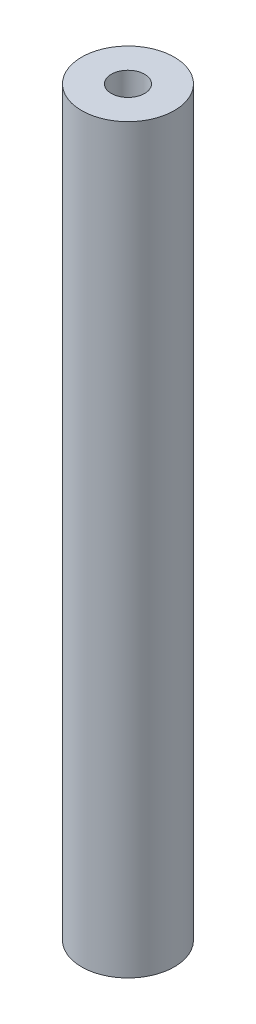
ISO-10303-21;
HEADER;
FILE_DESCRIPTION(('STEP AP214'),'2;1');
FILE_NAME('part.step','',(''),(''),'','','');
FILE_SCHEMA(('AUTOMOTIVE_DESIGN { 1 0 10303 214 1 1 1 1 }'));
ENDSEC;
DATA;
#1=APPLICATION_CONTEXT('core data for automotive mechanical design processes');
#2=APPLICATION_PROTOCOL_DEFINITION('international standard','automotive_design',2000,#1);
#3=PRODUCT_CONTEXT('',#1,'mechanical');
#4=PRODUCT('Part','Part','',(#3));
#5=PRODUCT_RELATED_PRODUCT_CATEGORY('part','',(#4));
#6=PRODUCT_DEFINITION_FORMATION('','',#4);
#7=PRODUCT_DEFINITION_CONTEXT('part definition',#1,'design');
#8=PRODUCT_DEFINITION('design','',#6,#7);
#9=PRODUCT_DEFINITION_SHAPE('','',#8);
#10=(LENGTH_UNIT() NAMED_UNIT(*) SI_UNIT(.MILLI.,.METRE.));
#11=(NAMED_UNIT(*) PLANE_ANGLE_UNIT() SI_UNIT($,.RADIAN.));
#12=(NAMED_UNIT(*) SI_UNIT($,.STERADIAN.) SOLID_ANGLE_UNIT());
#13=UNCERTAINTY_MEASURE_WITH_UNIT(LENGTH_MEASURE(1.E-05),#10,'distance_accuracy_value','');
#14=(GEOMETRIC_REPRESENTATION_CONTEXT(3) GLOBAL_UNCERTAINTY_ASSIGNED_CONTEXT((#13)) GLOBAL_UNIT_ASSIGNED_CONTEXT((#10,
#11,#12)) REPRESENTATION_CONTEXT('',''));
#15=CARTESIAN_POINT('',(0.,0.,0.));
#16=DIRECTION('',(0.,0.,1.));
#17=DIRECTION('',(1.,0.,0.));
#18=AXIS2_PLACEMENT_3D('',#15,#16,#17);
#19=CARTESIAN_POINT('',(0.,88.9,0.));
#20=DIRECTION('',(0.,-1.,0.));
#21=DIRECTION('',(0.,0.,-1.));
#22=AXIS2_PLACEMENT_3D('',#19,#20,#21);
#23=CYLINDRICAL_SURFACE('',#22,5.55625);
#24=CARTESIAN_POINT('',(0.,88.9,0.));
#25=DIRECTION('',(0.,1.,0.));
#26=DIRECTION('',(0.,0.,1.));
#27=AXIS2_PLACEMENT_3D('',#24,#25,#26);
#28=CIRCLE('',#27,5.55625);
#29=CARTESIAN_POINT('',(0.,88.9,5.55625));
#30=VERTEX_POINT('',#29);
#31=EDGE_CURVE('E10',#30,#30,#28,.T.);
#32=ORIENTED_EDGE('',*,*,#31,.F.);
#33=EDGE_LOOP('',(#32));
#34=FACE_BOUND('',#33,.T.);
#35=CARTESIAN_POINT('',(0.,0.,0.));
#36=DIRECTION('',(0.,1.,0.));
#37=DIRECTION('',(0.,0.,1.));
#38=AXIS2_PLACEMENT_3D('',#35,#36,#37);
#39=CIRCLE('',#38,5.55625);
#40=CARTESIAN_POINT('',(0.,0.,5.55625));
#41=VERTEX_POINT('',#40);
#42=EDGE_CURVE('E40',#41,#41,#39,.T.);
#43=ORIENTED_EDGE('',*,*,#42,.T.);
#44=EDGE_LOOP('',(#43));
#45=FACE_BOUND('',#44,.T.);
#46=ADVANCED_FACE('F37',(#34,#45),#23,.T.);
#47=CARTESIAN_POINT('',(0.,88.9,0.));
#48=DIRECTION('',(0.,1.,0.));
#49=DIRECTION('',(0.,0.,1.));
#50=AXIS2_PLACEMENT_3D('',#47,#48,#49);
#51=PLANE('',#50);
#52=CARTESIAN_POINT('',(0.,88.9,0.));
#53=DIRECTION('',(0.,1.,0.));
#54=DIRECTION('',(0.,0.,1.));
#55=AXIS2_PLACEMENT_3D('',#52,#53,#54);
#56=CIRCLE('',#55,1.999996);
#57=CARTESIAN_POINT('',(0.,88.9,1.999996));
#58=VERTEX_POINT('',#57);
#59=EDGE_CURVE('E49',#58,#58,#56,.T.);
#60=ORIENTED_EDGE('',*,*,#59,.F.);
#61=EDGE_LOOP('',(#60));
#62=FACE_BOUND('',#61,.T.);
#63=ORIENTED_EDGE('',*,*,#31,.T.);
#64=EDGE_LOOP('',(#63));
#65=FACE_BOUND('',#64,.T.);
#66=ADVANCED_FACE('F74',(#62,#65),#51,.T.);
#67=CARTESIAN_POINT('',(0.,0.,0.));
#68=DIRECTION('',(0.,1.,0.));
#69=DIRECTION('',(0.,0.,1.));
#70=AXIS2_PLACEMENT_3D('',#67,#68,#69);
#71=PLANE('',#70);
#72=CARTESIAN_POINT('',(0.,0.,0.));
#73=DIRECTION('',(0.,-1.,0.));
#74=DIRECTION('',(0.,0.,-1.));
#75=AXIS2_PLACEMENT_3D('',#72,#73,#74);
#76=CIRCLE('',#75,2.);
#77=CARTESIAN_POINT('',(0.,0.,-2.));
#78=VERTEX_POINT('',#77);
#79=EDGE_CURVE('E55',#78,#78,#76,.T.);
#80=ORIENTED_EDGE('',*,*,#79,.F.);
#81=EDGE_LOOP('',(#80));
#82=FACE_BOUND('',#81,.T.);
#83=ORIENTED_EDGE('',*,*,#42,.F.);
#84=EDGE_LOOP('',(#83));
#85=FACE_BOUND('',#84,.T.);
#86=ADVANCED_FACE('F70',(#82,#85),#71,.F.);
#87=CARTESIAN_POINT('',(0.,81.9,0.));
#88=DIRECTION('',(0.,1.,0.));
#89=DIRECTION('',(0.,0.,1.));
#90=AXIS2_PLACEMENT_3D('',#87,#88,#89);
#91=CYLINDRICAL_SURFACE('',#90,1.999996);
#92=CARTESIAN_POINT('',(0.,81.9,0.));
#93=DIRECTION('',(0.,1.,0.));
#94=DIRECTION('',(0.,0.,1.));
#95=AXIS2_PLACEMENT_3D('',#92,#93,#94);
#96=CIRCLE('',#95,1.999996);
#97=CARTESIAN_POINT('',(0.,81.9,1.999996));
#98=VERTEX_POINT('',#97);
#99=EDGE_CURVE('E47',#98,#98,#96,.T.);
#100=ORIENTED_EDGE('',*,*,#99,.F.);
#101=EDGE_LOOP('',(#100));
#102=FACE_BOUND('',#101,.T.);
#103=ORIENTED_EDGE('',*,*,#59,.T.);
#104=EDGE_LOOP('',(#103));
#105=FACE_BOUND('',#104,.T.);
#106=ADVANCED_FACE('F73',(#102,#105),#91,.F.);
#107=CARTESIAN_POINT('',(0.,81.9,0.));
#108=DIRECTION('',(0.,1.,0.));
#109=DIRECTION('',(0.,0.,1.));
#110=AXIS2_PLACEMENT_3D('',#107,#108,#109);
#111=PLANE('',#110);
#112=ORIENTED_EDGE('',*,*,#99,.T.);
#113=EDGE_LOOP('',(#112));
#114=FACE_BOUND('',#113,.T.);
#115=ADVANCED_FACE('F66',(#114),#111,.T.);
#116=CARTESIAN_POINT('',(0.,7.,0.));
#117=DIRECTION('',(0.,-1.,0.));
#118=DIRECTION('',(0.,0.,-1.));
#119=AXIS2_PLACEMENT_3D('',#116,#117,#118);
#120=CYLINDRICAL_SURFACE('',#119,2.);
#121=CARTESIAN_POINT('',(0.,7.,0.));
#122=DIRECTION('',(0.,-1.,0.));
#123=DIRECTION('',(0.,0.,-1.));
#124=AXIS2_PLACEMENT_3D('',#121,#122,#123);
#125=CIRCLE('',#124,2.);
#126=CARTESIAN_POINT('',(0.,7.,-2.));
#127=VERTEX_POINT('',#126);
#128=EDGE_CURVE('E52',#127,#127,#125,.T.);
#129=ORIENTED_EDGE('',*,*,#128,.F.);
#130=EDGE_LOOP('',(#129));
#131=FACE_BOUND('',#130,.T.);
#132=ORIENTED_EDGE('',*,*,#79,.T.);
#133=EDGE_LOOP('',(#132));
#134=FACE_BOUND('',#133,.T.);
#135=ADVANCED_FACE('F63',(#131,#134),#120,.F.);
#136=CARTESIAN_POINT('',(0.,7.,0.));
#137=DIRECTION('',(0.,-1.,0.));
#138=DIRECTION('',(0.,0.,-1.));
#139=AXIS2_PLACEMENT_3D('',#136,#137,#138);
#140=PLANE('',#139);
#141=ORIENTED_EDGE('',*,*,#128,.T.);
#142=EDGE_LOOP('',(#141));
#143=FACE_BOUND('',#142,.T.);
#144=ADVANCED_FACE('F61',(#143),#140,.T.);
#145=CLOSED_SHELL('',(#46,#66,#86,#106,#115,#135,#144));
#146=MANIFOLD_SOLID_BREP('B2',#145);
#147=ADVANCED_BREP_SHAPE_REPRESENTATION('',(#18,#146),#14);
#148=SHAPE_DEFINITION_REPRESENTATION(#9,#147);
ENDSEC;
END-ISO-10303-21;
